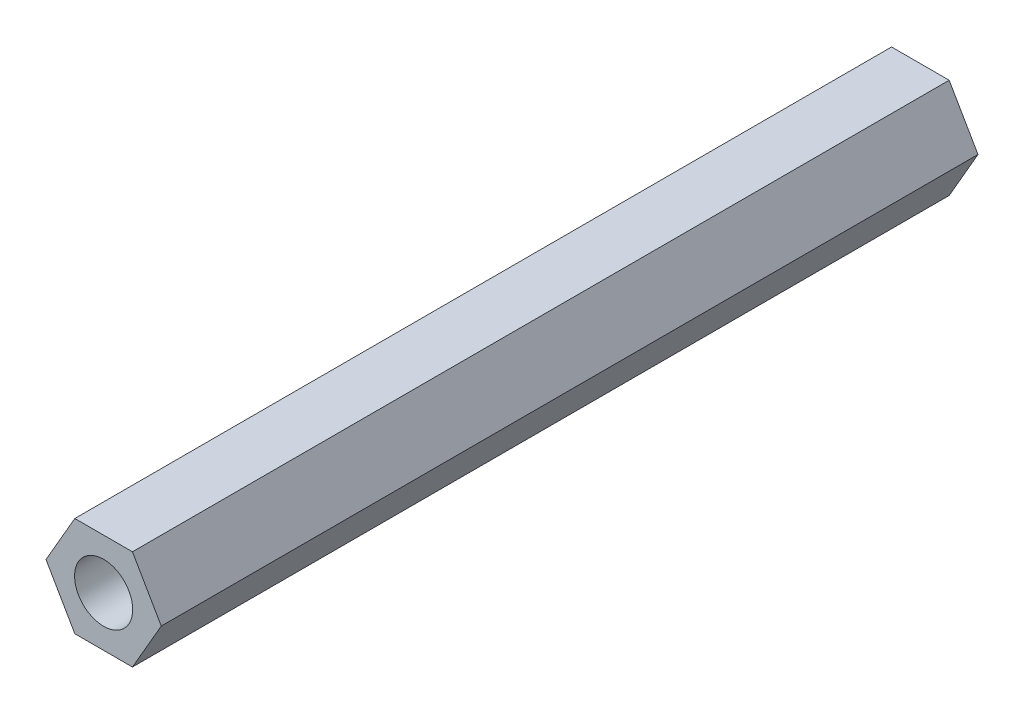
ISO-10303-21;
HEADER;
FILE_DESCRIPTION(('STEP AP214'),'2;1');
FILE_NAME('part.step','',(''),(''),'','','');
FILE_SCHEMA(('AUTOMOTIVE_DESIGN { 1 0 10303 214 1 1 1 1 }'));
ENDSEC;
DATA;
#1=APPLICATION_CONTEXT('core data for automotive mechanical design processes');
#2=APPLICATION_PROTOCOL_DEFINITION('international standard','automotive_design',2000,#1);
#3=PRODUCT_CONTEXT('',#1,'mechanical');
#4=PRODUCT('Part','Part','',(#3));
#5=PRODUCT_RELATED_PRODUCT_CATEGORY('part','',(#4));
#6=PRODUCT_DEFINITION_FORMATION('','',#4);
#7=PRODUCT_DEFINITION_CONTEXT('part definition',#1,'design');
#8=PRODUCT_DEFINITION('design','',#6,#7);
#9=PRODUCT_DEFINITION_SHAPE('','',#8);
#10=(LENGTH_UNIT() NAMED_UNIT(*) SI_UNIT(.MILLI.,.METRE.));
#11=(NAMED_UNIT(*) PLANE_ANGLE_UNIT() SI_UNIT($,.RADIAN.));
#12=(NAMED_UNIT(*) SI_UNIT($,.STERADIAN.) SOLID_ANGLE_UNIT());
#13=UNCERTAINTY_MEASURE_WITH_UNIT(LENGTH_MEASURE(1.E-05),#10,'distance_accuracy_value','');
#14=(GEOMETRIC_REPRESENTATION_CONTEXT(3) GLOBAL_UNCERTAINTY_ASSIGNED_CONTEXT((#13)) GLOBAL_UNIT_ASSIGNED_CONTEXT((#10,
#11,#12)) REPRESENTATION_CONTEXT('',''));
#15=CARTESIAN_POINT('',(0.,0.,0.));
#16=DIRECTION('',(0.,0.,1.));
#17=DIRECTION('',(1.,0.,0.));
#18=AXIS2_PLACEMENT_3D('',#15,#16,#17);
#19=CARTESIAN_POINT('',(0.,0.,-1.));
#20=DIRECTION('',(0.,0.,-1.));
#21=DIRECTION('',(1.,0.,0.));
#22=AXIS2_PLACEMENT_3D('',#19,#20,#21);
#23=CYLINDRICAL_SURFACE('',#22,1.6);
#24=CARTESIAN_POINT('',(0.,0.,0.));
#25=DIRECTION('',(0.,0.,-1.));
#26=DIRECTION('',(1.,0.,0.));
#27=AXIS2_PLACEMENT_3D('',#24,#25,#26);
#28=CIRCLE('',#27,1.6);
#29=CARTESIAN_POINT('',(1.6,0.,0.));
#30=VERTEX_POINT('',#29);
#31=EDGE_CURVE('E147',#30,#30,#28,.T.);
#32=ORIENTED_EDGE('',*,*,#31,.T.);
#33=DIRECTION('',(0.,0.,1.));
#34=VECTOR('',#33,1.);
#35=CARTESIAN_POINT('',(1.6,0.,-1.));
#36=LINE('',#35,#34);
#37=CARTESIAN_POINT('',(1.6,0.,45.));
#38=VERTEX_POINT('',#37);
#39=EDGE_CURVE('E9',#30,#38,#36,.T.);
#40=ORIENTED_EDGE('',*,*,#39,.T.);
#41=CARTESIAN_POINT('',(0.,0.,45.));
#42=DIRECTION('',(0.,0.,-1.));
#43=DIRECTION('',(1.,0.,0.));
#44=AXIS2_PLACEMENT_3D('',#41,#42,#43);
#45=CIRCLE('',#44,1.6);
#46=EDGE_CURVE('E161',#38,#38,#45,.T.);
#47=ORIENTED_EDGE('',*,*,#46,.F.);
#48=ORIENTED_EDGE('',*,*,#39,.F.);
#49=EDGE_LOOP('',(#32,#40,#47,#48));
#50=FACE_BOUND('',#49,.T.);
#51=ADVANCED_FACE('F15',(#50),#23,.F.);
#52=CARTESIAN_POINT('',(-3.175426480543,0.,0.));
#53=DIRECTION('',(0.866025403784329,0.50000000000019,0.));
#54=DIRECTION('',(0.,0.,-1.));
#55=AXIS2_PLACEMENT_3D('',#52,#53,#54);
#56=PLANE('',#55);
#57=DIRECTION('',(0.50000000000019,-0.866025403784329,0.));
#58=VECTOR('',#57,1.);
#59=CARTESIAN_POINT('',(-3.175426480543,0.,0.));
#60=LINE('',#59,#58);
#61=CARTESIAN_POINT('',(-3.175426480543,0.,0.));
#62=VERTEX_POINT('',#61);
#63=CARTESIAN_POINT('',(-1.587713240271,-2.75,0.));
#64=VERTEX_POINT('',#63);
#65=EDGE_CURVE('E144',#62,#64,#60,.T.);
#66=ORIENTED_EDGE('',*,*,#65,.T.);
#67=DIRECTION('',(0.,0.,1.));
#68=VECTOR('',#67,1.);
#69=CARTESIAN_POINT('',(-1.587713240271,-2.75,0.));
#70=LINE('',#69,#68);
#71=CARTESIAN_POINT('',(-1.587713240271,-2.75,45.));
#72=VERTEX_POINT('',#71);
#73=EDGE_CURVE('E43',#64,#72,#70,.T.);
#74=ORIENTED_EDGE('',*,*,#73,.T.);
#75=DIRECTION('',(0.50000000000019,-0.866025403784329,0.));
#76=VECTOR('',#75,1.);
#77=CARTESIAN_POINT('',(-3.175426480543,0.,45.));
#78=LINE('',#77,#76);
#79=CARTESIAN_POINT('',(-3.175426480543,0.,45.));
#80=VERTEX_POINT('',#79);
#81=EDGE_CURVE('E138',#80,#72,#78,.T.);
#82=ORIENTED_EDGE('',*,*,#81,.F.);
#83=DIRECTION('',(0.,0.,1.));
#84=VECTOR('',#83,1.);
#85=CARTESIAN_POINT('',(-3.175426480543,0.,0.));
#86=LINE('',#85,#84);
#87=EDGE_CURVE('E23',#62,#80,#86,.T.);
#88=ORIENTED_EDGE('',*,*,#87,.F.);
#89=EDGE_LOOP('',(#66,#74,#82,#88));
#90=FACE_BOUND('',#89,.T.);
#91=ADVANCED_FACE('F171',(#90),#56,.F.);
#92=CARTESIAN_POINT('',(-1.587713240271,2.75,0.));
#93=DIRECTION('',(0.866025403784329,-0.50000000000019,0.));
#94=DIRECTION('',(0.,0.,-1.));
#95=AXIS2_PLACEMENT_3D('',#92,#93,#94);
#96=PLANE('',#95);
#97=DIRECTION('',(-0.50000000000019,-0.866025403784329,0.));
#98=VECTOR('',#97,1.);
#99=CARTESIAN_POINT('',(-1.587713240271,2.75,0.));
#100=LINE('',#99,#98);
#101=CARTESIAN_POINT('',(-1.587713240271,2.75,0.));
#102=VERTEX_POINT('',#101);
#103=EDGE_CURVE('E153',#102,#62,#100,.T.);
#104=ORIENTED_EDGE('',*,*,#103,.T.);
#105=ORIENTED_EDGE('',*,*,#87,.T.);
#106=DIRECTION('',(-0.50000000000019,-0.866025403784329,0.));
#107=VECTOR('',#106,1.);
#108=CARTESIAN_POINT('',(-1.587713240271,2.75,45.));
#109=LINE('',#108,#107);
#110=CARTESIAN_POINT('',(-1.587713240271,2.75,45.));
#111=VERTEX_POINT('',#110);
#112=EDGE_CURVE('E143',#111,#80,#109,.T.);
#113=ORIENTED_EDGE('',*,*,#112,.F.);
#114=DIRECTION('',(0.,0.,1.));
#115=VECTOR('',#114,1.);
#116=CARTESIAN_POINT('',(-1.587713240271,2.75,0.));
#117=LINE('',#116,#115);
#118=EDGE_CURVE('E140',#102,#111,#117,.T.);
#119=ORIENTED_EDGE('',*,*,#118,.F.);
#120=EDGE_LOOP('',(#104,#105,#113,#119));
#121=FACE_BOUND('',#120,.T.);
#122=ADVANCED_FACE('F169',(#121),#96,.F.);
#123=CARTESIAN_POINT('',(-1.587713240271,-2.75,0.));
#124=DIRECTION('',(0.,1.,0.));
#125=DIRECTION('',(1.,0.,0.));
#126=AXIS2_PLACEMENT_3D('',#123,#124,#125);
#127=PLANE('',#126);
#128=DIRECTION('',(1.,0.,0.));
#129=VECTOR('',#128,1.);
#130=CARTESIAN_POINT('',(-1.587713240271,-2.75,0.));
#131=LINE('',#130,#129);
#132=CARTESIAN_POINT('',(1.587713240271,-2.75,0.));
#133=VERTEX_POINT('',#132);
#134=EDGE_CURVE('E142',#64,#133,#131,.T.);
#135=ORIENTED_EDGE('',*,*,#134,.T.);
#136=DIRECTION('',(0.,0.,1.));
#137=VECTOR('',#136,1.);
#138=CARTESIAN_POINT('',(1.587713240271,-2.75,0.));
#139=LINE('',#138,#137);
#140=CARTESIAN_POINT('',(1.587713240271,-2.75,45.));
#141=VERTEX_POINT('',#140);
#142=EDGE_CURVE('E110',#133,#141,#139,.T.);
#143=ORIENTED_EDGE('',*,*,#142,.T.);
#144=DIRECTION('',(1.,0.,0.));
#145=VECTOR('',#144,1.);
#146=CARTESIAN_POINT('',(-1.587713240271,-2.75,45.));
#147=LINE('',#146,#145);
#148=EDGE_CURVE('E105',#72,#141,#147,.T.);
#149=ORIENTED_EDGE('',*,*,#148,.F.);
#150=ORIENTED_EDGE('',*,*,#73,.F.);
#151=EDGE_LOOP('',(#135,#143,#149,#150));
#152=FACE_BOUND('',#151,.T.);
#153=ADVANCED_FACE('F190',(#152),#127,.F.);
#154=CARTESIAN_POINT('',(0.,0.,45.));
#155=DIRECTION('',(0.,0.,1.));
#156=DIRECTION('',(1.,0.,0.));
#157=AXIS2_PLACEMENT_3D('',#154,#155,#156);
#158=PLANE('',#157);
#159=ORIENTED_EDGE('',*,*,#46,.T.);
#160=EDGE_LOOP('',(#159));
#161=FACE_BOUND('',#160,.T.);
#162=DIRECTION('',(-0.50000000000019,0.866025403784329,0.));
#163=VECTOR('',#162,1.);
#164=CARTESIAN_POINT('',(3.175426480543,0.,45.));
#165=LINE('',#164,#163);
#166=CARTESIAN_POINT('',(3.175426480543,0.,45.));
#167=VERTEX_POINT('',#166);
#168=CARTESIAN_POINT('',(1.587713240271,2.75,45.));
#169=VERTEX_POINT('',#168);
#170=EDGE_CURVE('E97',#167,#169,#165,.T.);
#171=ORIENTED_EDGE('',*,*,#170,.T.);
#172=DIRECTION('',(-1.,0.,0.));
#173=VECTOR('',#172,1.);
#174=CARTESIAN_POINT('',(1.587713240271,2.75,45.));
#175=LINE('',#174,#173);
#176=EDGE_CURVE('E148',#169,#111,#175,.T.);
#177=ORIENTED_EDGE('',*,*,#176,.T.);
#178=ORIENTED_EDGE('',*,*,#112,.T.);
#179=ORIENTED_EDGE('',*,*,#81,.T.);
#180=ORIENTED_EDGE('',*,*,#148,.T.);
#181=DIRECTION('',(0.50000000000019,0.866025403784329,0.));
#182=VECTOR('',#181,1.);
#183=CARTESIAN_POINT('',(1.587713240271,-2.75,45.));
#184=LINE('',#183,#182);
#185=EDGE_CURVE('E94',#141,#167,#184,.T.);
#186=ORIENTED_EDGE('',*,*,#185,.T.);
#187=EDGE_LOOP('',(#171,#177,#178,#179,#180,#186));
#188=FACE_BOUND('',#187,.T.);
#189=ADVANCED_FACE('F96',(#161,#188),#158,.T.);
#190=CARTESIAN_POINT('',(0.,0.,0.));
#191=DIRECTION('',(0.,0.,1.));
#192=DIRECTION('',(1.,0.,0.));
#193=AXIS2_PLACEMENT_3D('',#190,#191,#192);
#194=PLANE('',#193);
#195=ORIENTED_EDGE('',*,*,#31,.F.);
#196=EDGE_LOOP('',(#195));
#197=FACE_BOUND('',#196,.T.);
#198=DIRECTION('',(0.50000000000019,0.866025403784329,0.));
#199=VECTOR('',#198,1.);
#200=CARTESIAN_POINT('',(1.587713240271,-2.75,0.));
#201=LINE('',#200,#199);
#202=CARTESIAN_POINT('',(3.175426480543,0.,0.));
#203=VERTEX_POINT('',#202);
#204=EDGE_CURVE('E107',#133,#203,#201,.T.);
#205=ORIENTED_EDGE('',*,*,#204,.F.);
#206=ORIENTED_EDGE('',*,*,#134,.F.);
#207=ORIENTED_EDGE('',*,*,#65,.F.);
#208=ORIENTED_EDGE('',*,*,#103,.F.);
#209=DIRECTION('',(-1.,0.,0.));
#210=VECTOR('',#209,1.);
#211=CARTESIAN_POINT('',(1.587713240271,2.75,0.));
#212=LINE('',#211,#210);
#213=CARTESIAN_POINT('',(1.587713240271,2.75,0.));
#214=VERTEX_POINT('',#213);
#215=EDGE_CURVE('E132',#214,#102,#212,.T.);
#216=ORIENTED_EDGE('',*,*,#215,.F.);
#217=DIRECTION('',(-0.50000000000019,0.866025403784329,0.));
#218=VECTOR('',#217,1.);
#219=CARTESIAN_POINT('',(3.175426480543,0.,0.));
#220=LINE('',#219,#218);
#221=EDGE_CURVE('E126',#203,#214,#220,.T.);
#222=ORIENTED_EDGE('',*,*,#221,.F.);
#223=EDGE_LOOP('',(#205,#206,#207,#208,#216,#222));
#224=FACE_BOUND('',#223,.T.);
#225=ADVANCED_FACE('F182',(#197,#224),#194,.F.);
#226=CARTESIAN_POINT('',(1.587713240271,2.75,0.));
#227=DIRECTION('',(0.,-1.,0.));
#228=DIRECTION('',(-1.,0.,0.));
#229=AXIS2_PLACEMENT_3D('',#226,#227,#228);
#230=PLANE('',#229);
#231=ORIENTED_EDGE('',*,*,#215,.T.);
#232=ORIENTED_EDGE('',*,*,#118,.T.);
#233=ORIENTED_EDGE('',*,*,#176,.F.);
#234=DIRECTION('',(0.,0.,1.));
#235=VECTOR('',#234,1.);
#236=CARTESIAN_POINT('',(1.587713240271,2.75,0.));
#237=LINE('',#236,#235);
#238=EDGE_CURVE('E122',#214,#169,#237,.T.);
#239=ORIENTED_EDGE('',*,*,#238,.F.);
#240=EDGE_LOOP('',(#231,#232,#233,#239));
#241=FACE_BOUND('',#240,.T.);
#242=ADVANCED_FACE('F177',(#241),#230,.F.);
#243=CARTESIAN_POINT('',(1.587713240271,-2.75,0.));
#244=DIRECTION('',(-0.866025403784329,0.50000000000019,0.));
#245=DIRECTION('',(0.,0.,1.));
#246=AXIS2_PLACEMENT_3D('',#243,#244,#245);
#247=PLANE('',#246);
#248=ORIENTED_EDGE('',*,*,#204,.T.);
#249=DIRECTION('',(0.,0.,1.));
#250=VECTOR('',#249,1.);
#251=CARTESIAN_POINT('',(3.175426480543,0.,0.));
#252=LINE('',#251,#250);
#253=EDGE_CURVE('E112',#203,#167,#252,.T.);
#254=ORIENTED_EDGE('',*,*,#253,.T.);
#255=ORIENTED_EDGE('',*,*,#185,.F.);
#256=ORIENTED_EDGE('',*,*,#142,.F.);
#257=EDGE_LOOP('',(#248,#254,#255,#256));
#258=FACE_BOUND('',#257,.T.);
#259=ADVANCED_FACE('F115',(#258),#247,.F.);
#260=CARTESIAN_POINT('',(3.175426480543,0.,0.));
#261=DIRECTION('',(-0.866025403784329,-0.50000000000019,0.));
#262=DIRECTION('',(-0.50000000000019,0.866025403784329,0.));
#263=AXIS2_PLACEMENT_3D('',#260,#261,#262);
#264=PLANE('',#263);
#265=ORIENTED_EDGE('',*,*,#221,.T.);
#266=ORIENTED_EDGE('',*,*,#238,.T.);
#267=ORIENTED_EDGE('',*,*,#170,.F.);
#268=ORIENTED_EDGE('',*,*,#253,.F.);
#269=EDGE_LOOP('',(#265,#266,#267,#268));
#270=FACE_BOUND('',#269,.T.);
#271=ADVANCED_FACE('F118',(#270),#264,.F.);
#272=CLOSED_SHELL('',(#51,#91,#122,#153,#189,#225,#242,#259,#271));
#273=MANIFOLD_SOLID_BREP('B1',#272);
#274=ADVANCED_BREP_SHAPE_REPRESENTATION('',(#18,#273),#14);
#275=SHAPE_DEFINITION_REPRESENTATION(#9,#274);
ENDSEC;
END-ISO-10303-21;
